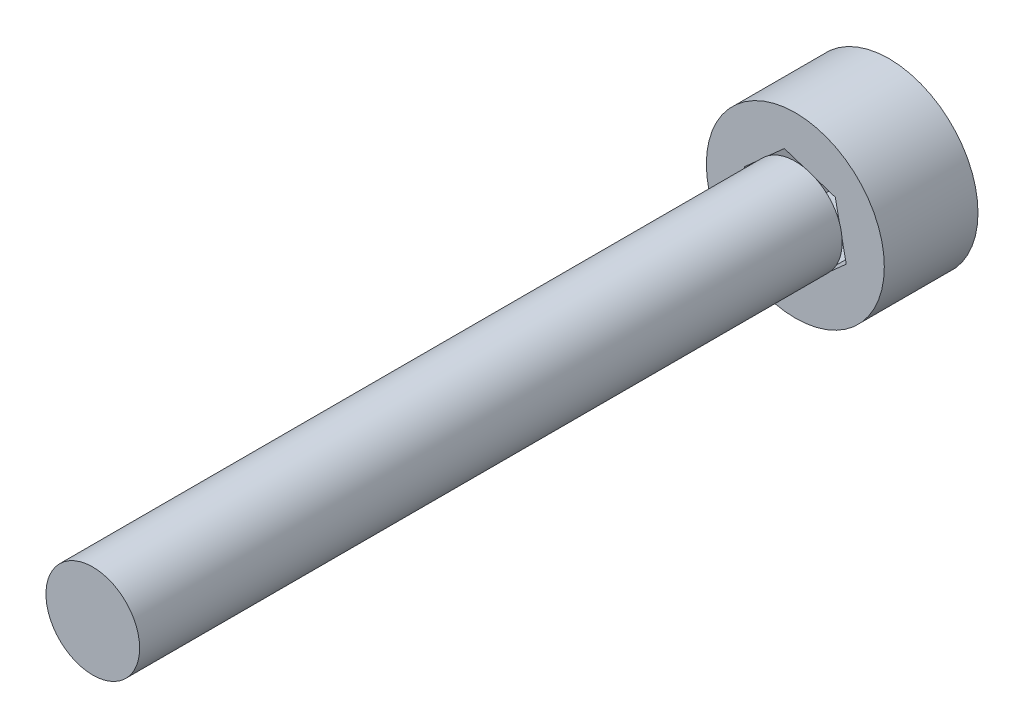
ISO-10303-21;
HEADER;
FILE_DESCRIPTION(('STEP AP214'),'2;1');
FILE_NAME('part.step','',(''),(''),'','','');
FILE_SCHEMA(('AUTOMOTIVE_DESIGN { 1 0 10303 214 1 1 1 1 }'));
ENDSEC;
DATA;
#1=APPLICATION_CONTEXT('core data for automotive mechanical design processes');
#2=APPLICATION_PROTOCOL_DEFINITION('international standard','automotive_design',2000,#1);
#3=PRODUCT_CONTEXT('',#1,'mechanical');
#4=PRODUCT('Part','Part','',(#3));
#5=PRODUCT_RELATED_PRODUCT_CATEGORY('part','',(#4));
#6=PRODUCT_DEFINITION_FORMATION('','',#4);
#7=PRODUCT_DEFINITION_CONTEXT('part definition',#1,'design');
#8=PRODUCT_DEFINITION('design','',#6,#7);
#9=PRODUCT_DEFINITION_SHAPE('','',#8);
#10=(LENGTH_UNIT() NAMED_UNIT(*) SI_UNIT(.MILLI.,.METRE.));
#11=(NAMED_UNIT(*) PLANE_ANGLE_UNIT() SI_UNIT($,.RADIAN.));
#12=(NAMED_UNIT(*) SI_UNIT($,.STERADIAN.) SOLID_ANGLE_UNIT());
#13=UNCERTAINTY_MEASURE_WITH_UNIT(LENGTH_MEASURE(1.E-05),#10,'distance_accuracy_value','');
#14=(GEOMETRIC_REPRESENTATION_CONTEXT(3) GLOBAL_UNCERTAINTY_ASSIGNED_CONTEXT((#13)) GLOBAL_UNIT_ASSIGNED_CONTEXT((#10,
#11,#12)) REPRESENTATION_CONTEXT('',''));
#15=CARTESIAN_POINT('',(0.,0.,0.));
#16=DIRECTION('',(0.,0.,1.));
#17=DIRECTION('',(1.,0.,0.));
#18=AXIS2_PLACEMENT_3D('',#15,#16,#17);
#19=CARTESIAN_POINT('',(0.,0.,2.));
#20=DIRECTION('',(0.,0.,1.));
#21=DIRECTION('',(1.,0.,0.));
#22=AXIS2_PLACEMENT_3D('',#19,#20,#21);
#23=PLANE('',#22);
#24=DIRECTION('',(-0.950310259761245,0.311304369054652,0.));
#25=VECTOR('',#24,1.);
#26=CARTESIAN_POINT('',(0.235225698569587,-1.1198924964661,2.));
#27=LINE('',#26,#25);
#28=CARTESIAN_POINT('',(0.235225698569587,-1.1198924964661,2.));
#29=VERTEX_POINT('',#28);
#30=CARTESIAN_POINT('',(-0.181428607552822,-0.983404118540005,2.));
#31=VERTEX_POINT('',#30);
#32=EDGE_CURVE('E157',#29,#31,#27,.T.);
#33=ORIENTED_EDGE('',*,*,#32,.T.);
#34=CARTESIAN_POINT('',(0.,0.,2.));
#35=DIRECTION('',(0.,0.,1.));
#36=DIRECTION('',(1.,0.,0.));
#37=AXIS2_PLACEMENT_3D('',#34,#35,#36);
#38=CIRCLE('',#37,1.);
#39=CARTESIAN_POINT('',(-0.435588196040018,-0.90014605674335,2.));
#40=VERTEX_POINT('',#39);
#41=EDGE_CURVE('E152',#40,#31,#38,.T.);
#42=ORIENTED_EDGE('',*,*,#41,.F.);
#43=CARTESIAN_POINT('',(-0.852242502162426,-0.763657678817253,2.));
#44=VERTEX_POINT('',#43);
#45=EDGE_CURVE('E129',#40,#44,#27,.T.);
#46=ORIENTED_EDGE('',*,*,#45,.T.);
#47=DIRECTION('',(-0.205557637970208,0.978645010957553,0.));
#48=VECTOR('',#47,1.);
#49=CARTESIAN_POINT('',(-0.852242502162426,-0.763657678817253,2.));
#50=LINE('',#49,#48);
#51=CARTESIAN_POINT('',(-0.942367252618298,-0.334580276156022,2.));
#52=VERTEX_POINT('',#51);
#53=EDGE_CURVE('E139',#44,#52,#50,.T.);
#54=ORIENTED_EDGE('',*,*,#53,.T.);
#55=CARTESIAN_POINT('',(-0.997343450276139,-0.0728425850123836,2.));
#56=VERTEX_POINT('',#55);
#57=EDGE_CURVE('E220',#56,#52,#38,.T.);
#58=ORIENTED_EDGE('',*,*,#57,.F.);
#59=CARTESIAN_POINT('',(-1.08746820073201,0.356234817648851,2.));
#60=VERTEX_POINT('',#59);
#61=EDGE_CURVE('E148',#56,#60,#50,.T.);
#62=ORIENTED_EDGE('',*,*,#61,.T.);
#63=DIRECTION('',(0.744752621791037,0.667340641902901,0.));
#64=VECTOR('',#63,1.);
#65=CARTESIAN_POINT('',(-1.08746820073201,0.356234817648851,2.));
#66=LINE('',#65,#64);
#67=CARTESIAN_POINT('',(-0.760938645065466,0.648823842383996,2.));
#68=VERTEX_POINT('',#67);
#69=EDGE_CURVE('E166',#60,#68,#66,.T.);
#70=ORIENTED_EDGE('',*,*,#69,.T.);
#71=CARTESIAN_POINT('',(-0.561755254236135,0.827303471730957,2.));
#72=VERTEX_POINT('',#71);
#73=EDGE_CURVE('E223',#72,#68,#38,.T.);
#74=ORIENTED_EDGE('',*,*,#73,.F.);
#75=CARTESIAN_POINT('',(-0.235225698569587,1.1198924964661,2.));
#76=VERTEX_POINT('',#75);
#77=EDGE_CURVE('E146',#72,#76,#66,.T.);
#78=ORIENTED_EDGE('',*,*,#77,.T.);
#79=DIRECTION('',(0.950310259761245,-0.311304369054652,0.));
#80=VECTOR('',#79,1.);
#81=CARTESIAN_POINT('',(-0.235225698569587,1.1198924964661,2.));
#82=LINE('',#81,#80);
#83=CARTESIAN_POINT('',(0.181428607552835,0.983404118540002,2.));
#84=VERTEX_POINT('',#83);
#85=EDGE_CURVE('E170',#76,#84,#82,.T.);
#86=ORIENTED_EDGE('',*,*,#85,.T.);
#87=CARTESIAN_POINT('',(0.435588196040006,0.900146056743356,2.));
#88=VERTEX_POINT('',#87);
#89=EDGE_CURVE('E213',#88,#84,#38,.T.);
#90=ORIENTED_EDGE('',*,*,#89,.F.);
#91=CARTESIAN_POINT('',(0.852242502162427,0.763657678817255,2.));
#92=VERTEX_POINT('',#91);
#93=EDGE_CURVE('E168',#88,#92,#82,.T.);
#94=ORIENTED_EDGE('',*,*,#93,.T.);
#95=DIRECTION('',(0.205557637970207,-0.978645010957553,0.));
#96=VECTOR('',#95,1.);
#97=CARTESIAN_POINT('',(0.852242502162427,0.763657678817255,2.));
#98=LINE('',#97,#96);
#99=CARTESIAN_POINT('',(0.942367252618301,0.334580276156014,2.));
#100=VERTEX_POINT('',#99);
#101=EDGE_CURVE('E175',#92,#100,#98,.T.);
#102=ORIENTED_EDGE('',*,*,#101,.T.);
#103=CARTESIAN_POINT('',(0.997343450276139,0.0728425850123915,2.));
#104=VERTEX_POINT('',#103);
#105=EDGE_CURVE('E206',#104,#100,#38,.T.);
#106=ORIENTED_EDGE('',*,*,#105,.F.);
#107=CARTESIAN_POINT('',(1.08746820073201,-0.356234817648848,2.));
#108=VERTEX_POINT('',#107);
#109=EDGE_CURVE('E173',#104,#108,#98,.T.);
#110=ORIENTED_EDGE('',*,*,#109,.T.);
#111=DIRECTION('',(-0.744752621791037,-0.667340641902901,0.));
#112=VECTOR('',#111,1.);
#113=CARTESIAN_POINT('',(1.08746820073201,-0.356234817648848,2.));
#114=LINE('',#113,#112);
#115=CARTESIAN_POINT('',(0.760938645065476,-0.648823842383984,2.));
#116=VERTEX_POINT('',#115);
#117=EDGE_CURVE('E135',#108,#116,#114,.T.);
#118=ORIENTED_EDGE('',*,*,#117,.T.);
#119=CARTESIAN_POINT('',(0.561755254236123,-0.827303471730966,2.));
#120=VERTEX_POINT('',#119);
#121=EDGE_CURVE('E214',#120,#116,#38,.T.);
#122=ORIENTED_EDGE('',*,*,#121,.F.);
#123=EDGE_CURVE('E178',#120,#29,#114,.T.);
#124=ORIENTED_EDGE('',*,*,#123,.T.);
#125=EDGE_LOOP('',(#33,#42,#46,#54,#58,#62,#70,#74,#78,#86,#90,#94,#102,#106,#110,#118,#122,#124));
#126=FACE_BOUND('',#125,.T.);
#127=CARTESIAN_POINT('',(0.,0.,2.));
#128=DIRECTION('',(0.,0.,1.));
#129=DIRECTION('',(1.,0.,0.));
#130=AXIS2_PLACEMENT_3D('',#127,#128,#129);
#131=CIRCLE('',#130,1.9);
#132=CARTESIAN_POINT('',(1.9,0.,2.));
#133=VERTEX_POINT('',#132);
#134=EDGE_CURVE('E11',#133,#133,#131,.T.);
#135=ORIENTED_EDGE('',*,*,#134,.T.);
#136=EDGE_LOOP('',(#135));
#137=FACE_BOUND('',#136,.T.);
#138=ADVANCED_FACE('F37',(#126,#137),#23,.T.);
#139=CARTESIAN_POINT('',(0.,0.,2.));
#140=DIRECTION('',(0.,0.,-1.));
#141=DIRECTION('',(-1.,0.,0.));
#142=AXIS2_PLACEMENT_3D('',#139,#140,#141);
#143=CYLINDRICAL_SURFACE('',#142,1.9);
#144=ORIENTED_EDGE('',*,*,#134,.F.);
#145=EDGE_LOOP('',(#144));
#146=FACE_BOUND('',#145,.T.);
#147=CARTESIAN_POINT('',(0.,0.,0.));
#148=DIRECTION('',(0.,0.,1.));
#149=DIRECTION('',(1.,0.,0.));
#150=AXIS2_PLACEMENT_3D('',#147,#148,#149);
#151=CIRCLE('',#150,1.9);
#152=CARTESIAN_POINT('',(1.9,0.,0.));
#153=VERTEX_POINT('',#152);
#154=EDGE_CURVE('E41',#153,#153,#151,.T.);
#155=ORIENTED_EDGE('',*,*,#154,.T.);
#156=EDGE_LOOP('',(#155));
#157=FACE_BOUND('',#156,.T.);
#158=ADVANCED_FACE('F39',(#146,#157),#143,.T.);
#159=CARTESIAN_POINT('',(0.,0.,0.));
#160=DIRECTION('',(0.,0.,1.));
#161=DIRECTION('',(1.,0.,0.));
#162=AXIS2_PLACEMENT_3D('',#159,#160,#161);
#163=PLANE('',#162);
#164=DIRECTION('',(-0.205557637970208,0.978645010957553,0.));
#165=VECTOR('',#164,1.);
#166=CARTESIAN_POINT('',(-0.852242502162426,-0.763657678817253,0.));
#167=LINE('',#166,#165);
#168=CARTESIAN_POINT('',(-0.852242502162426,-0.763657678817253,0.));
#169=VERTEX_POINT('',#168);
#170=CARTESIAN_POINT('',(-1.08746820073201,0.356234817648851,0.));
#171=VERTEX_POINT('',#170);
#172=EDGE_CURVE('E183',#169,#171,#167,.T.);
#173=ORIENTED_EDGE('',*,*,#172,.F.);
#174=DIRECTION('',(-0.950310259761245,0.311304369054652,0.));
#175=VECTOR('',#174,1.);
#176=CARTESIAN_POINT('',(0.235225698569587,-1.1198924964661,0.));
#177=LINE('',#176,#175);
#178=CARTESIAN_POINT('',(0.235225698569587,-1.1198924964661,0.));
#179=VERTEX_POINT('',#178);
#180=EDGE_CURVE('E52',#179,#169,#177,.T.);
#181=ORIENTED_EDGE('',*,*,#180,.F.);
#182=DIRECTION('',(-0.744752621791037,-0.667340641902901,0.));
#183=VECTOR('',#182,1.);
#184=CARTESIAN_POINT('',(1.08746820073201,-0.356234817648848,0.));
#185=LINE('',#184,#183);
#186=CARTESIAN_POINT('',(1.08746820073201,-0.356234817648848,0.));
#187=VERTEX_POINT('',#186);
#188=EDGE_CURVE('E155',#187,#179,#185,.T.);
#189=ORIENTED_EDGE('',*,*,#188,.F.);
#190=DIRECTION('',(0.205557637970207,-0.978645010957553,0.));
#191=VECTOR('',#190,1.);
#192=CARTESIAN_POINT('',(0.852242502162427,0.763657678817255,0.));
#193=LINE('',#192,#191);
#194=CARTESIAN_POINT('',(0.852242502162427,0.763657678817255,0.));
#195=VERTEX_POINT('',#194);
#196=EDGE_CURVE('E159',#195,#187,#193,.T.);
#197=ORIENTED_EDGE('',*,*,#196,.F.);
#198=DIRECTION('',(0.950310259761245,-0.311304369054652,0.));
#199=VECTOR('',#198,1.);
#200=CARTESIAN_POINT('',(-0.235225698569587,1.1198924964661,0.));
#201=LINE('',#200,#199);
#202=CARTESIAN_POINT('',(-0.235225698569587,1.1198924964661,0.));
#203=VERTEX_POINT('',#202);
#204=EDGE_CURVE('E188',#203,#195,#201,.T.);
#205=ORIENTED_EDGE('',*,*,#204,.F.);
#206=DIRECTION('',(0.744752621791037,0.667340641902901,0.));
#207=VECTOR('',#206,1.);
#208=CARTESIAN_POINT('',(-1.08746820073201,0.356234817648851,0.));
#209=LINE('',#208,#207);
#210=EDGE_CURVE('E185',#171,#203,#209,.T.);
#211=ORIENTED_EDGE('',*,*,#210,.F.);
#212=EDGE_LOOP('',(#173,#181,#189,#197,#205,#211));
#213=FACE_BOUND('',#212,.T.);
#214=ORIENTED_EDGE('',*,*,#154,.F.);
#215=EDGE_LOOP('',(#214));
#216=FACE_BOUND('',#215,.T.);
#217=ADVANCED_FACE('F248',(#213,#216),#163,.F.);
#218=CARTESIAN_POINT('',(0.,0.,17.));
#219=DIRECTION('',(0.,0.,-1.));
#220=DIRECTION('',(-1.,0.,0.));
#221=AXIS2_PLACEMENT_3D('',#218,#219,#220);
#222=CYLINDRICAL_SURFACE('',#221,1.);
#223=CARTESIAN_POINT('',(0.,0.,17.));
#224=DIRECTION('',(0.,0.,1.));
#225=DIRECTION('',(1.,0.,0.));
#226=AXIS2_PLACEMENT_3D('',#223,#224,#225);
#227=CIRCLE('',#226,1.);
#228=CARTESIAN_POINT('',(1.,0.,17.));
#229=VERTEX_POINT('',#228);
#230=EDGE_CURVE('E203',#229,#229,#227,.T.);
#231=ORIENTED_EDGE('',*,*,#230,.F.);
#232=EDGE_LOOP('',(#231));
#233=FACE_BOUND('',#232,.T.);
#234=ORIENTED_EDGE('',*,*,#105,.T.);
#235=EDGE_CURVE('E208',#100,#88,#38,.T.);
#236=ORIENTED_EDGE('',*,*,#235,.T.);
#237=ORIENTED_EDGE('',*,*,#89,.T.);
#238=EDGE_CURVE('E225',#84,#72,#38,.T.);
#239=ORIENTED_EDGE('',*,*,#238,.T.);
#240=ORIENTED_EDGE('',*,*,#73,.T.);
#241=EDGE_CURVE('E221',#68,#56,#38,.T.);
#242=ORIENTED_EDGE('',*,*,#241,.T.);
#243=ORIENTED_EDGE('',*,*,#57,.T.);
#244=EDGE_CURVE('E219',#52,#40,#38,.T.);
#245=ORIENTED_EDGE('',*,*,#244,.T.);
#246=ORIENTED_EDGE('',*,*,#41,.T.);
#247=EDGE_CURVE('E216',#31,#120,#38,.T.);
#248=ORIENTED_EDGE('',*,*,#247,.T.);
#249=ORIENTED_EDGE('',*,*,#121,.T.);
#250=EDGE_CURVE('E195',#116,#104,#38,.T.);
#251=ORIENTED_EDGE('',*,*,#250,.T.);
#252=EDGE_LOOP('',(#234,#236,#237,#239,#240,#242,#243,#245,#246,#248,#249,#251));
#253=FACE_BOUND('',#252,.T.);
#254=ADVANCED_FACE('F230',(#233,#253),#222,.T.);
#255=CARTESIAN_POINT('',(0.,0.,17.));
#256=DIRECTION('',(0.,0.,1.));
#257=DIRECTION('',(1.,0.,0.));
#258=AXIS2_PLACEMENT_3D('',#255,#256,#257);
#259=PLANE('',#258);
#260=ORIENTED_EDGE('',*,*,#230,.T.);
#261=EDGE_LOOP('',(#260));
#262=FACE_BOUND('',#261,.T.);
#263=ADVANCED_FACE('F281',(#262),#259,.T.);
#264=CARTESIAN_POINT('',(0.,0.,2.));
#265=DIRECTION('',(0.,0.,-1.));
#266=DIRECTION('',(-1.,0.,0.));
#267=AXIS2_PLACEMENT_3D('',#264,#265,#266);
#268=PLANE('',#267);
#269=ORIENTED_EDGE('',*,*,#238,.F.);
#270=EDGE_CURVE('E174',#84,#88,#82,.T.);
#271=ORIENTED_EDGE('',*,*,#270,.T.);
#272=ORIENTED_EDGE('',*,*,#235,.F.);
#273=EDGE_CURVE('E179',#100,#104,#98,.T.);
#274=ORIENTED_EDGE('',*,*,#273,.T.);
#275=ORIENTED_EDGE('',*,*,#250,.F.);
#276=EDGE_CURVE('E60',#116,#120,#114,.T.);
#277=ORIENTED_EDGE('',*,*,#276,.T.);
#278=ORIENTED_EDGE('',*,*,#247,.F.);
#279=EDGE_CURVE('E154',#31,#40,#27,.T.);
#280=ORIENTED_EDGE('',*,*,#279,.T.);
#281=ORIENTED_EDGE('',*,*,#244,.F.);
#282=EDGE_CURVE('E142',#52,#56,#50,.T.);
#283=ORIENTED_EDGE('',*,*,#282,.T.);
#284=ORIENTED_EDGE('',*,*,#241,.F.);
#285=EDGE_CURVE('E169',#68,#72,#66,.T.);
#286=ORIENTED_EDGE('',*,*,#285,.T.);
#287=EDGE_LOOP('',(#269,#271,#272,#274,#275,#277,#278,#280,#281,#283,#284,#286));
#288=FACE_BOUND('',#287,.T.);
#289=ADVANCED_FACE('F239',(#288),#268,.T.);
#290=CARTESIAN_POINT('',(0.235225698569587,-1.1198924964661,2.));
#291=DIRECTION('',(-0.311304369054652,-0.950310259761245,0.));
#292=DIRECTION('',(0.950310259761245,-0.311304369054652,0.));
#293=AXIS2_PLACEMENT_3D('',#290,#291,#292);
#294=PLANE('',#293);
#295=ORIENTED_EDGE('',*,*,#180,.T.);
#296=DIRECTION('',(0.,0.,-1.));
#297=VECTOR('',#296,1.);
#298=CARTESIAN_POINT('',(-0.852242502162426,-0.763657678817253,2.));
#299=LINE('',#298,#297);
#300=EDGE_CURVE('E124',#44,#169,#299,.T.);
#301=ORIENTED_EDGE('',*,*,#300,.F.);
#302=ORIENTED_EDGE('',*,*,#45,.F.);
#303=ORIENTED_EDGE('',*,*,#279,.F.);
#304=ORIENTED_EDGE('',*,*,#32,.F.);
#305=DIRECTION('',(0.,0.,-1.));
#306=VECTOR('',#305,1.);
#307=CARTESIAN_POINT('',(0.235225698569587,-1.1198924964661,2.));
#308=LINE('',#307,#306);
#309=EDGE_CURVE('E193',#29,#179,#308,.T.);
#310=ORIENTED_EDGE('',*,*,#309,.T.);
#311=EDGE_LOOP('',(#295,#301,#302,#303,#304,#310));
#312=FACE_BOUND('',#311,.T.);
#313=ADVANCED_FACE('F126',(#312),#294,.F.);
#314=CARTESIAN_POINT('',(1.08746820073201,-0.356234817648848,2.));
#315=DIRECTION('',(0.667340641902901,-0.744752621791037,0.));
#316=DIRECTION('',(0.744752621791037,0.667340641902901,0.));
#317=AXIS2_PLACEMENT_3D('',#314,#315,#316);
#318=PLANE('',#317);
#319=ORIENTED_EDGE('',*,*,#188,.T.);
#320=ORIENTED_EDGE('',*,*,#309,.F.);
#321=ORIENTED_EDGE('',*,*,#123,.F.);
#322=ORIENTED_EDGE('',*,*,#276,.F.);
#323=ORIENTED_EDGE('',*,*,#117,.F.);
#324=DIRECTION('',(0.,0.,-1.));
#325=VECTOR('',#324,1.);
#326=CARTESIAN_POINT('',(1.08746820073201,-0.356234817648848,2.));
#327=LINE('',#326,#325);
#328=EDGE_CURVE('E196',#108,#187,#327,.T.);
#329=ORIENTED_EDGE('',*,*,#328,.T.);
#330=EDGE_LOOP('',(#319,#320,#321,#322,#323,#329));
#331=FACE_BOUND('',#330,.T.);
#332=ADVANCED_FACE('F259',(#331),#318,.F.);
#333=CARTESIAN_POINT('',(0.852242502162427,0.763657678817255,2.));
#334=DIRECTION('',(0.978645010957553,0.205557637970207,0.));
#335=DIRECTION('',(-0.205557637970207,0.978645010957553,0.));
#336=AXIS2_PLACEMENT_3D('',#333,#334,#335);
#337=PLANE('',#336);
#338=ORIENTED_EDGE('',*,*,#196,.T.);
#339=ORIENTED_EDGE('',*,*,#328,.F.);
#340=ORIENTED_EDGE('',*,*,#109,.F.);
#341=ORIENTED_EDGE('',*,*,#273,.F.);
#342=ORIENTED_EDGE('',*,*,#101,.F.);
#343=DIRECTION('',(0.,0.,-1.));
#344=VECTOR('',#343,1.);
#345=CARTESIAN_POINT('',(0.852242502162427,0.763657678817255,2.));
#346=LINE('',#345,#344);
#347=EDGE_CURVE('E198',#92,#195,#346,.T.);
#348=ORIENTED_EDGE('',*,*,#347,.T.);
#349=EDGE_LOOP('',(#338,#339,#340,#341,#342,#348));
#350=FACE_BOUND('',#349,.T.);
#351=ADVANCED_FACE('F254',(#350),#337,.F.);
#352=CARTESIAN_POINT('',(-0.235225698569587,1.1198924964661,2.));
#353=DIRECTION('',(0.311304369054652,0.950310259761245,0.));
#354=DIRECTION('',(-0.950310259761245,0.311304369054652,0.));
#355=AXIS2_PLACEMENT_3D('',#352,#353,#354);
#356=PLANE('',#355);
#357=ORIENTED_EDGE('',*,*,#204,.T.);
#358=ORIENTED_EDGE('',*,*,#347,.F.);
#359=ORIENTED_EDGE('',*,*,#93,.F.);
#360=ORIENTED_EDGE('',*,*,#270,.F.);
#361=ORIENTED_EDGE('',*,*,#85,.F.);
#362=DIRECTION('',(0.,0.,-1.));
#363=VECTOR('',#362,1.);
#364=CARTESIAN_POINT('',(-0.235225698569587,1.1198924964661,2.));
#365=LINE('',#364,#363);
#366=EDGE_CURVE('E200',#76,#203,#365,.T.);
#367=ORIENTED_EDGE('',*,*,#366,.T.);
#368=EDGE_LOOP('',(#357,#358,#359,#360,#361,#367));
#369=FACE_BOUND('',#368,.T.);
#370=ADVANCED_FACE('F238',(#369),#356,.F.);
#371=CARTESIAN_POINT('',(-1.08746820073201,0.356234817648851,2.));
#372=DIRECTION('',(-0.667340641902901,0.744752621791037,0.));
#373=DIRECTION('',(-0.744752621791038,-0.667340641902901,0.));
#374=AXIS2_PLACEMENT_3D('',#371,#372,#373);
#375=PLANE('',#374);
#376=ORIENTED_EDGE('',*,*,#210,.T.);
#377=ORIENTED_EDGE('',*,*,#366,.F.);
#378=ORIENTED_EDGE('',*,*,#77,.F.);
#379=ORIENTED_EDGE('',*,*,#285,.F.);
#380=ORIENTED_EDGE('',*,*,#69,.F.);
#381=DIRECTION('',(0.,0.,-1.));
#382=VECTOR('',#381,1.);
#383=CARTESIAN_POINT('',(-1.08746820073201,0.356234817648851,2.));
#384=LINE('',#383,#382);
#385=EDGE_CURVE('E134',#60,#171,#384,.T.);
#386=ORIENTED_EDGE('',*,*,#385,.T.);
#387=EDGE_LOOP('',(#376,#377,#378,#379,#380,#386));
#388=FACE_BOUND('',#387,.T.);
#389=ADVANCED_FACE('F244',(#388),#375,.F.);
#390=CARTESIAN_POINT('',(-0.852242502162426,-0.763657678817253,2.));
#391=DIRECTION('',(-0.978645010957553,-0.205557637970208,0.));
#392=DIRECTION('',(0.205557637970208,-0.978645010957553,0.));
#393=AXIS2_PLACEMENT_3D('',#390,#391,#392);
#394=PLANE('',#393);
#395=ORIENTED_EDGE('',*,*,#172,.T.);
#396=ORIENTED_EDGE('',*,*,#385,.F.);
#397=ORIENTED_EDGE('',*,*,#61,.F.);
#398=ORIENTED_EDGE('',*,*,#282,.F.);
#399=ORIENTED_EDGE('',*,*,#53,.F.);
#400=ORIENTED_EDGE('',*,*,#300,.T.);
#401=EDGE_LOOP('',(#395,#396,#397,#398,#399,#400));
#402=FACE_BOUND('',#401,.T.);
#403=ADVANCED_FACE('F140',(#402),#394,.F.);
#404=CLOSED_SHELL('',(#138,#158,#217,#254,#263,#289,#313,#332,#351,#370,#389,#403));
#405=MANIFOLD_SOLID_BREP('B2',#404);
#406=ADVANCED_BREP_SHAPE_REPRESENTATION('',(#18,#405),#14);
#407=SHAPE_DEFINITION_REPRESENTATION(#9,#406);
ENDSEC;
END-ISO-10303-21;
